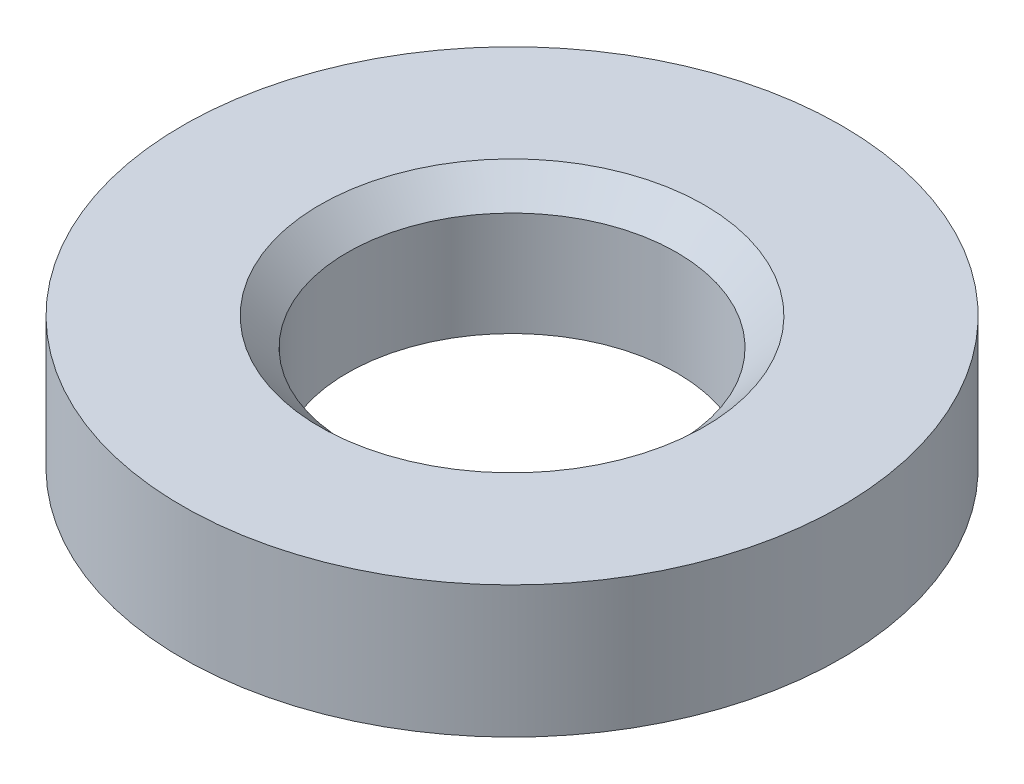
ISO-10303-21;
HEADER;
FILE_DESCRIPTION(('STEP AP214'),'2;1');
FILE_NAME('part.step','',(''),(''),'','','');
FILE_SCHEMA(('AUTOMOTIVE_DESIGN { 1 0 10303 214 1 1 1 1 }'));
ENDSEC;
DATA;
#1=APPLICATION_CONTEXT('core data for automotive mechanical design processes');
#2=APPLICATION_PROTOCOL_DEFINITION('international standard','automotive_design',2000,#1);
#3=PRODUCT_CONTEXT('',#1,'mechanical');
#4=PRODUCT('Part','Part','',(#3));
#5=PRODUCT_RELATED_PRODUCT_CATEGORY('part','',(#4));
#6=PRODUCT_DEFINITION_FORMATION('','',#4);
#7=PRODUCT_DEFINITION_CONTEXT('part definition',#1,'design');
#8=PRODUCT_DEFINITION('design','',#6,#7);
#9=PRODUCT_DEFINITION_SHAPE('','',#8);
#10=(LENGTH_UNIT() NAMED_UNIT(*) SI_UNIT(.MILLI.,.METRE.));
#11=(NAMED_UNIT(*) PLANE_ANGLE_UNIT() SI_UNIT($,.RADIAN.));
#12=(NAMED_UNIT(*) SI_UNIT($,.STERADIAN.) SOLID_ANGLE_UNIT());
#13=UNCERTAINTY_MEASURE_WITH_UNIT(LENGTH_MEASURE(1.E-05),#10,'distance_accuracy_value','');
#14=(GEOMETRIC_REPRESENTATION_CONTEXT(3) GLOBAL_UNCERTAINTY_ASSIGNED_CONTEXT((#13)) GLOBAL_UNIT_ASSIGNED_CONTEXT((#10,
#11,#12)) REPRESENTATION_CONTEXT('',''));
#15=CARTESIAN_POINT('',(0.,0.,0.));
#16=DIRECTION('',(0.,0.,1.));
#17=DIRECTION('',(1.,0.,0.));
#18=AXIS2_PLACEMENT_3D('',#15,#16,#17);
#19=CARTESIAN_POINT('',(0.,12.,0.));
#20=DIRECTION('',(0.,-1.,0.));
#21=DIRECTION('',(0.,0.,-1.));
#22=AXIS2_PLACEMENT_3D('',#19,#20,#21);
#23=CYLINDRICAL_SURFACE('',#22,30.);
#24=CARTESIAN_POINT('',(0.,12.,0.));
#25=DIRECTION('',(0.,-1.,0.));
#26=DIRECTION('',(0.,0.,-1.));
#27=AXIS2_PLACEMENT_3D('',#24,#25,#26);
#28=CIRCLE('',#27,30.);
#29=CARTESIAN_POINT('',(0.,12.,-30.));
#30=VERTEX_POINT('',#29);
#31=EDGE_CURVE('E10',#30,#30,#28,.T.);
#32=ORIENTED_EDGE('',*,*,#31,.T.);
#33=EDGE_LOOP('',(#32));
#34=FACE_BOUND('',#33,.T.);
#35=CARTESIAN_POINT('',(0.,0.,0.));
#36=DIRECTION('',(0.,-1.,0.));
#37=DIRECTION('',(0.,0.,-1.));
#38=AXIS2_PLACEMENT_3D('',#35,#36,#37);
#39=CIRCLE('',#38,30.);
#40=CARTESIAN_POINT('',(0.,0.,-30.));
#41=VERTEX_POINT('',#40);
#42=EDGE_CURVE('E50',#41,#41,#39,.T.);
#43=ORIENTED_EDGE('',*,*,#42,.F.);
#44=EDGE_LOOP('',(#43));
#45=FACE_BOUND('',#44,.T.);
#46=ADVANCED_FACE('F31',(#34,#45),#23,.T.);
#47=CARTESIAN_POINT('',(30.,12.,0.));
#48=DIRECTION('',(0.,1.,0.));
#49=DIRECTION('',(0.,0.,1.));
#50=AXIS2_PLACEMENT_3D('',#47,#48,#49);
#51=PLANE('',#50);
#52=CARTESIAN_POINT('',(0.,12.,0.));
#53=DIRECTION('',(0.,-1.,0.));
#54=DIRECTION('',(0.,0.,-1.));
#55=AXIS2_PLACEMENT_3D('',#52,#53,#54);
#56=CIRCLE('',#55,17.5);
#57=CARTESIAN_POINT('',(0.,12.,-17.5));
#58=VERTEX_POINT('',#57);
#59=EDGE_CURVE('E37',#58,#58,#56,.T.);
#60=ORIENTED_EDGE('',*,*,#59,.T.);
#61=EDGE_LOOP('',(#60));
#62=FACE_BOUND('',#61,.T.);
#63=ORIENTED_EDGE('',*,*,#31,.F.);
#64=EDGE_LOOP('',(#63));
#65=FACE_BOUND('',#64,.T.);
#66=ADVANCED_FACE('F58',(#62,#65),#51,.T.);
#67=CARTESIAN_POINT('',(0.,12.,0.));
#68=DIRECTION('',(0.,1.,0.));
#69=DIRECTION('',(0.,0.,1.));
#70=AXIS2_PLACEMENT_3D('',#67,#68,#69);
#71=CONICAL_SURFACE('',#70,17.5,0.785398163397448);
#72=CARTESIAN_POINT('',(0.,9.5,0.));
#73=DIRECTION('',(0.,-1.,0.));
#74=DIRECTION('',(0.,0.,-1.));
#75=AXIS2_PLACEMENT_3D('',#72,#73,#74);
#76=CIRCLE('',#75,15.);
#77=CARTESIAN_POINT('',(0.,9.5,-15.));
#78=VERTEX_POINT('',#77);
#79=EDGE_CURVE('E41',#78,#78,#76,.T.);
#80=ORIENTED_EDGE('',*,*,#79,.T.);
#81=EDGE_LOOP('',(#80));
#82=FACE_BOUND('',#81,.T.);
#83=ORIENTED_EDGE('',*,*,#59,.F.);
#84=EDGE_LOOP('',(#83));
#85=FACE_BOUND('',#84,.T.);
#86=ADVANCED_FACE('F62',(#82,#85),#71,.F.);
#87=CARTESIAN_POINT('',(0.,12.,0.));
#88=DIRECTION('',(0.,-1.,0.));
#89=DIRECTION('',(0.,0.,-1.));
#90=AXIS2_PLACEMENT_3D('',#87,#88,#89);
#91=CYLINDRICAL_SURFACE('',#90,15.);
#92=CARTESIAN_POINT('',(0.,0.,0.));
#93=DIRECTION('',(0.,-1.,0.));
#94=DIRECTION('',(0.,0.,-1.));
#95=AXIS2_PLACEMENT_3D('',#92,#93,#94);
#96=CIRCLE('',#95,15.);
#97=CARTESIAN_POINT('',(0.,0.,-15.));
#98=VERTEX_POINT('',#97);
#99=EDGE_CURVE('E45',#98,#98,#96,.T.);
#100=ORIENTED_EDGE('',*,*,#99,.T.);
#101=EDGE_LOOP('',(#100));
#102=FACE_BOUND('',#101,.T.);
#103=ORIENTED_EDGE('',*,*,#79,.F.);
#104=EDGE_LOOP('',(#103));
#105=FACE_BOUND('',#104,.T.);
#106=ADVANCED_FACE('F66',(#102,#105),#91,.F.);
#107=CARTESIAN_POINT('',(15.,0.,0.));
#108=DIRECTION('',(0.,-1.,0.));
#109=DIRECTION('',(0.,0.,-1.));
#110=AXIS2_PLACEMENT_3D('',#107,#108,#109);
#111=PLANE('',#110);
#112=ORIENTED_EDGE('',*,*,#42,.T.);
#113=EDGE_LOOP('',(#112));
#114=FACE_BOUND('',#113,.T.);
#115=ORIENTED_EDGE('',*,*,#99,.F.);
#116=EDGE_LOOP('',(#115));
#117=FACE_BOUND('',#116,.T.);
#118=ADVANCED_FACE('F54',(#114,#117),#111,.T.);
#119=CLOSED_SHELL('',(#46,#66,#86,#106,#118));
#120=MANIFOLD_SOLID_BREP('B2',#119);
#121=ADVANCED_BREP_SHAPE_REPRESENTATION('',(#18,#120),#14);
#122=SHAPE_DEFINITION_REPRESENTATION(#9,#121);
ENDSEC;
END-ISO-10303-21;
